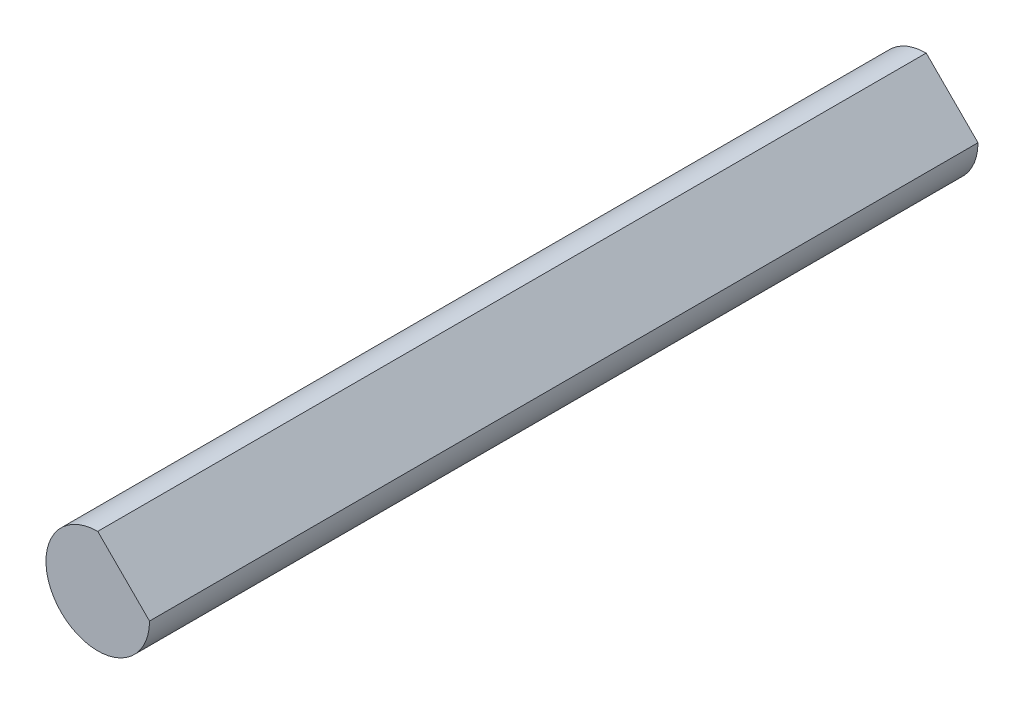
ISO-10303-21;
HEADER;
FILE_DESCRIPTION(('STEP AP214'),'2;1');
FILE_NAME('part.step','',(''),(''),'','','');
FILE_SCHEMA(('AUTOMOTIVE_DESIGN { 1 0 10303 214 1 1 1 1 }'));
ENDSEC;
DATA;
#1=APPLICATION_CONTEXT('core data for automotive mechanical design processes');
#2=APPLICATION_PROTOCOL_DEFINITION('international standard','automotive_design',2000,#1);
#3=PRODUCT_CONTEXT('',#1,'mechanical');
#4=PRODUCT('Part','Part','',(#3));
#5=PRODUCT_RELATED_PRODUCT_CATEGORY('part','',(#4));
#6=PRODUCT_DEFINITION_FORMATION('','',#4);
#7=PRODUCT_DEFINITION_CONTEXT('part definition',#1,'design');
#8=PRODUCT_DEFINITION('design','',#6,#7);
#9=PRODUCT_DEFINITION_SHAPE('','',#8);
#10=(LENGTH_UNIT() NAMED_UNIT(*) SI_UNIT(.MILLI.,.METRE.));
#11=(NAMED_UNIT(*) PLANE_ANGLE_UNIT() SI_UNIT($,.RADIAN.));
#12=(NAMED_UNIT(*) SI_UNIT($,.STERADIAN.) SOLID_ANGLE_UNIT());
#13=UNCERTAINTY_MEASURE_WITH_UNIT(LENGTH_MEASURE(1.E-05),#10,'distance_accuracy_value','');
#14=(GEOMETRIC_REPRESENTATION_CONTEXT(3) GLOBAL_UNCERTAINTY_ASSIGNED_CONTEXT((#13)) GLOBAL_UNIT_ASSIGNED_CONTEXT((#10,
#11,#12)) REPRESENTATION_CONTEXT('',''));
#15=CARTESIAN_POINT('',(0.,0.,0.));
#16=DIRECTION('',(0.,0.,1.));
#17=DIRECTION('',(1.,0.,0.));
#18=AXIS2_PLACEMENT_3D('',#15,#16,#17);
#19=CARTESIAN_POINT('',(0.,0.,50.8));
#20=DIRECTION('',(0.,0.,-1.));
#21=DIRECTION('',(-1.,0.,0.));
#22=AXIS2_PLACEMENT_3D('',#19,#20,#21);
#23=CYLINDRICAL_SURFACE('',#22,3.175);
#24=CARTESIAN_POINT('',(0.,0.,50.8));
#25=DIRECTION('',(0.,0.,1.));
#26=DIRECTION('',(1.,0.,0.));
#27=AXIS2_PLACEMENT_3D('',#24,#25,#26);
#28=CIRCLE('',#27,3.175);
#29=CARTESIAN_POINT('',(0.,3.175,50.8));
#30=VERTEX_POINT('',#29);
#31=CARTESIAN_POINT('',(3.175,0.,50.8));
#32=VERTEX_POINT('',#31);
#33=EDGE_CURVE('E11',#30,#32,#28,.T.);
#34=ORIENTED_EDGE('',*,*,#33,.F.);
#35=DIRECTION('',(0.,0.,1.));
#36=VECTOR('',#35,1.);
#37=CARTESIAN_POINT('',(0.,3.175,0.));
#38=LINE('',#37,#36);
#39=CARTESIAN_POINT('',(0.,3.175,0.));
#40=VERTEX_POINT('',#39);
#41=EDGE_CURVE('E55',#40,#30,#38,.T.);
#42=ORIENTED_EDGE('',*,*,#41,.F.);
#43=CARTESIAN_POINT('',(0.,0.,0.));
#44=DIRECTION('',(0.,0.,1.));
#45=DIRECTION('',(1.,0.,0.));
#46=AXIS2_PLACEMENT_3D('',#43,#44,#45);
#47=CIRCLE('',#46,3.175);
#48=CARTESIAN_POINT('',(3.175,0.,0.));
#49=VERTEX_POINT('',#48);
#50=EDGE_CURVE('E35',#40,#49,#47,.T.);
#51=ORIENTED_EDGE('',*,*,#50,.T.);
#52=DIRECTION('',(0.,0.,1.));
#53=VECTOR('',#52,1.);
#54=CARTESIAN_POINT('',(3.175,0.,0.));
#55=LINE('',#54,#53);
#56=EDGE_CURVE('E46',#49,#32,#55,.T.);
#57=ORIENTED_EDGE('',*,*,#56,.T.);
#58=EDGE_LOOP('',(#34,#42,#51,#57));
#59=FACE_BOUND('',#58,.T.);
#60=ADVANCED_FACE('F32',(#59),#23,.T.);
#61=CARTESIAN_POINT('',(0.,0.,50.8));
#62=DIRECTION('',(0.,0.,1.));
#63=DIRECTION('',(1.,0.,0.));
#64=AXIS2_PLACEMENT_3D('',#61,#62,#63);
#65=PLANE('',#64);
#66=DIRECTION('',(0.707106781186547,-0.707106781186547,0.));
#67=VECTOR('',#66,1.);
#68=CARTESIAN_POINT('',(0.,3.175,50.8));
#69=LINE('',#68,#67);
#70=EDGE_CURVE('E58',#30,#32,#69,.T.);
#71=ORIENTED_EDGE('',*,*,#70,.F.);
#72=ORIENTED_EDGE('',*,*,#33,.T.);
#73=EDGE_LOOP('',(#71,#72));
#74=FACE_BOUND('',#73,.T.);
#75=ADVANCED_FACE('F65',(#74),#65,.T.);
#76=CARTESIAN_POINT('',(0.,0.,0.));
#77=DIRECTION('',(0.,0.,1.));
#78=DIRECTION('',(1.,0.,0.));
#79=AXIS2_PLACEMENT_3D('',#76,#77,#78);
#80=PLANE('',#79);
#81=ORIENTED_EDGE('',*,*,#50,.F.);
#82=DIRECTION('',(0.707106781186547,-0.707106781186547,0.));
#83=VECTOR('',#82,1.);
#84=CARTESIAN_POINT('',(0.,3.175,0.));
#85=LINE('',#84,#83);
#86=EDGE_CURVE('E51',#40,#49,#85,.T.);
#87=ORIENTED_EDGE('',*,*,#86,.T.);
#88=EDGE_LOOP('',(#81,#87));
#89=FACE_BOUND('',#88,.T.);
#90=ADVANCED_FACE('F70',(#89),#80,.F.);
#91=CARTESIAN_POINT('',(0.,3.175,0.));
#92=DIRECTION('',(-0.707106781186548,-0.707106781186548,0.));
#93=DIRECTION('',(0.707106781186548,-0.707106781186548,0.));
#94=AXIS2_PLACEMENT_3D('',#91,#92,#93);
#95=PLANE('',#94);
#96=ORIENTED_EDGE('',*,*,#70,.T.);
#97=ORIENTED_EDGE('',*,*,#56,.F.);
#98=ORIENTED_EDGE('',*,*,#86,.F.);
#99=ORIENTED_EDGE('',*,*,#41,.T.);
#100=EDGE_LOOP('',(#96,#97,#98,#99));
#101=FACE_BOUND('',#100,.T.);
#102=ADVANCED_FACE('F57',(#101),#95,.F.);
#103=CLOSED_SHELL('',(#60,#75,#90,#102));
#104=MANIFOLD_SOLID_BREP('B2',#103);
#105=ADVANCED_BREP_SHAPE_REPRESENTATION('',(#18,#104),#14);
#106=SHAPE_DEFINITION_REPRESENTATION(#9,#105);
ENDSEC;
END-ISO-10303-21;
